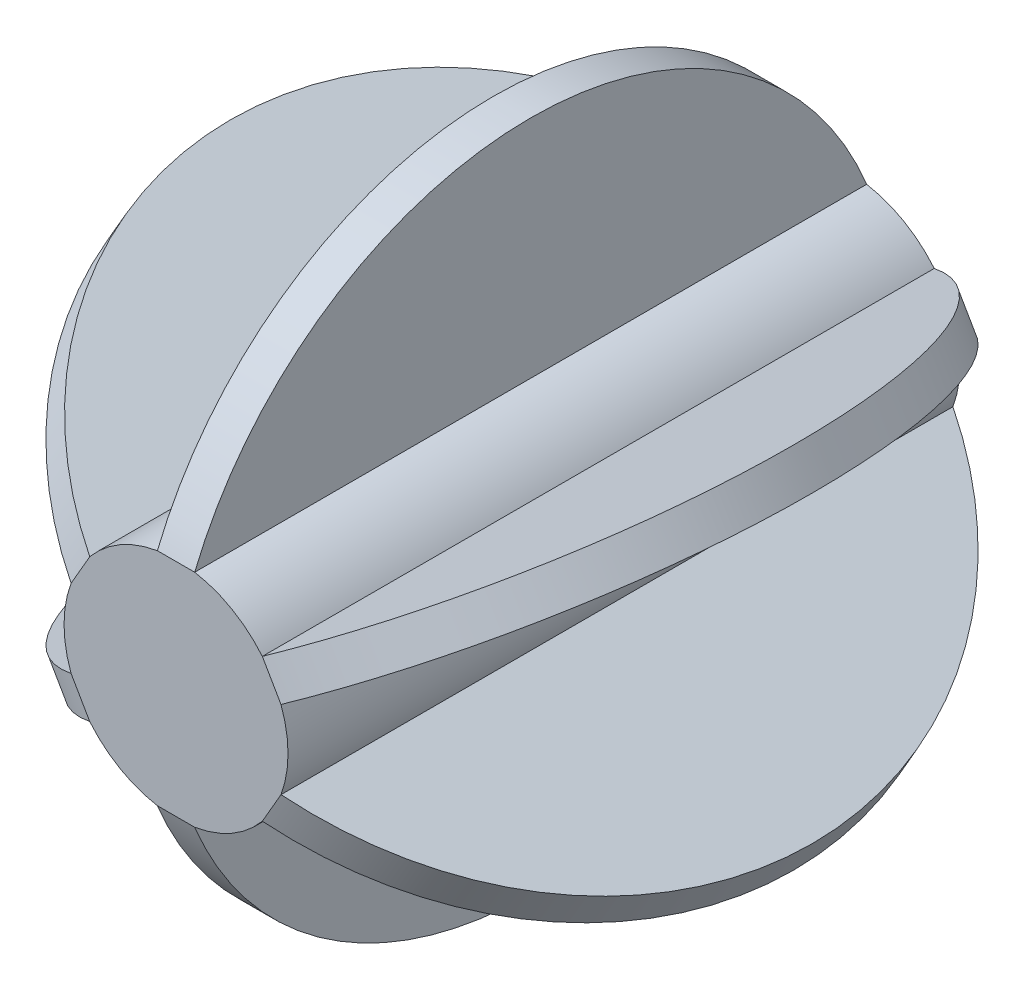
ISO-10303-21;
HEADER;
FILE_DESCRIPTION(('STEP AP214'),'2;1');
FILE_NAME('part.step','',(''),(''),'','','');
FILE_SCHEMA(('AUTOMOTIVE_DESIGN { 1 0 10303 214 1 1 1 1 }'));
ENDSEC;
DATA;
#1=APPLICATION_CONTEXT('core data for automotive mechanical design processes');
#2=APPLICATION_PROTOCOL_DEFINITION('international standard','automotive_design',2000,#1);
#3=PRODUCT_CONTEXT('',#1,'mechanical');
#4=PRODUCT('Part','Part','',(#3));
#5=PRODUCT_RELATED_PRODUCT_CATEGORY('part','',(#4));
#6=PRODUCT_DEFINITION_FORMATION('','',#4);
#7=PRODUCT_DEFINITION_CONTEXT('part definition',#1,'design');
#8=PRODUCT_DEFINITION('design','',#6,#7);
#9=PRODUCT_DEFINITION_SHAPE('','',#8);
#10=(LENGTH_UNIT() NAMED_UNIT(*) SI_UNIT(.MILLI.,.METRE.));
#11=(NAMED_UNIT(*) PLANE_ANGLE_UNIT() SI_UNIT($,.RADIAN.));
#12=(NAMED_UNIT(*) SI_UNIT($,.STERADIAN.) SOLID_ANGLE_UNIT());
#13=UNCERTAINTY_MEASURE_WITH_UNIT(LENGTH_MEASURE(1.E-05),#10,'distance_accuracy_value','');
#14=(GEOMETRIC_REPRESENTATION_CONTEXT(3) GLOBAL_UNCERTAINTY_ASSIGNED_CONTEXT((#13)) GLOBAL_UNIT_ASSIGNED_CONTEXT((#10,
#11,#12)) REPRESENTATION_CONTEXT('',''));
#15=CARTESIAN_POINT('',(0.,0.,0.));
#16=DIRECTION('',(0.,0.,1.));
#17=DIRECTION('',(1.,0.,0.));
#18=AXIS2_PLACEMENT_3D('',#15,#16,#17);
#19=CARTESIAN_POINT('',(0.,0.,90.));
#20=DIRECTION('',(0.,0.,-1.));
#21=DIRECTION('',(-1.,0.,0.));
#22=AXIS2_PLACEMENT_3D('',#19,#20,#21);
#23=CYLINDRICAL_SURFACE('',#22,15.);
#24=CARTESIAN_POINT('',(0.,0.,0.));
#25=DIRECTION('',(0.,0.,1.));
#26=DIRECTION('',(1.,0.,0.));
#27=AXIS2_PLACEMENT_3D('',#24,#25,#26);
#28=CIRCLE('',#27,15.);
#29=CARTESIAN_POINT('',(-2.50000000000006,14.790199457749,0.));
#30=VERTEX_POINT('',#29);
#31=CARTESIAN_POINT('',(-11.5586884574496,9.56016323833555,0.));
#32=VERTEX_POINT('',#31);
#33=EDGE_CURVE('E162',#30,#32,#28,.T.);
#34=ORIENTED_EDGE('',*,*,#33,.T.);
#35=DIRECTION('',(0.,0.,-1.));
#36=VECTOR('',#35,1.);
#37=CARTESIAN_POINT('',(-11.5586884574496,9.56016323833555,90.));
#38=LINE('',#37,#36);
#39=CARTESIAN_POINT('',(-11.5586884574496,9.56016323833555,90.));
#40=VERTEX_POINT('',#39);
#41=EDGE_CURVE('E176',#40,#32,#38,.T.);
#42=ORIENTED_EDGE('',*,*,#41,.F.);
#43=CARTESIAN_POINT('',(0.,0.,90.));
#44=DIRECTION('',(0.,0.,1.));
#45=DIRECTION('',(1.,0.,0.));
#46=AXIS2_PLACEMENT_3D('',#43,#44,#45);
#47=CIRCLE('',#46,15.);
#48=CARTESIAN_POINT('',(-2.50000000000017,14.790199457749,90.));
#49=VERTEX_POINT('',#48);
#50=EDGE_CURVE('E163',#49,#40,#47,.T.);
#51=ORIENTED_EDGE('',*,*,#50,.F.);
#52=DIRECTION('',(0.,0.,-1.));
#53=VECTOR('',#52,1.);
#54=CARTESIAN_POINT('',(-2.50000000000006,14.790199457749,90.));
#55=LINE('',#54,#53);
#56=EDGE_CURVE('E148',#49,#30,#55,.T.);
#57=ORIENTED_EDGE('',*,*,#56,.T.);
#58=EDGE_LOOP('',(#34,#42,#51,#57));
#59=FACE_BOUND('',#58,.T.);
#60=ADVANCED_FACE('F33',(#59),#23,.T.);
#61=CARTESIAN_POINT('',(-11.5586884574496,9.56016323833555,90.));
#62=DIRECTION('',(-0.499999999999995,-0.866025403784442,0.));
#63=DIRECTION('',(0.866025403784442,-0.499999999999995,0.));
#64=AXIS2_PLACEMENT_3D('',#61,#62,#63);
#65=PLANE('',#64);
#66=CARTESIAN_POINT('',(4.38545693247616,0.354806605463526,45.));
#67=DIRECTION('',(0.499999999999995,0.866025403784442,0.));
#68=DIRECTION('',(-0.866025403784442,0.499999999999995,0.));
#69=AXIS2_PLACEMENT_3D('',#66,#67,#68);
#70=CIRCLE('',#69,48.6205138079952);
#71=EDGE_CURVE('E47',#40,#32,#70,.F.);
#72=ORIENTED_EDGE('',*,*,#71,.F.);
#73=ORIENTED_EDGE('',*,*,#41,.T.);
#74=EDGE_LOOP('',(#72,#73));
#75=FACE_BOUND('',#74,.T.);
#76=ADVANCED_FACE('F291',(#75),#65,.F.);
#77=CARTESIAN_POINT('',(-14.0586884574495,5.23003621941334,90.));
#78=DIRECTION('',(0.499999999999995,0.866025403784442,0.));
#79=DIRECTION('',(-0.866025403784442,0.499999999999995,0.));
#80=AXIS2_PLACEMENT_3D('',#77,#78,#79);
#81=PLANE('',#80);
#82=DIRECTION('',(0.,0.,-1.));
#83=VECTOR('',#82,1.);
#84=CARTESIAN_POINT('',(-14.0586884574495,5.23003621941334,90.));
#85=LINE('',#84,#83);
#86=CARTESIAN_POINT('',(-14.0586884574495,5.23003621941334,90.));
#87=VERTEX_POINT('',#86);
#88=CARTESIAN_POINT('',(-14.0586884574495,5.23003621941334,0.));
#89=VERTEX_POINT('',#88);
#90=EDGE_CURVE('E169',#87,#89,#85,.T.);
#91=ORIENTED_EDGE('',*,*,#90,.F.);
#92=CARTESIAN_POINT('',(1.88545693247618,-3.97532041345869,45.));
#93=DIRECTION('',(0.499999999999995,0.866025403784442,0.));
#94=DIRECTION('',(-0.866025403784442,0.499999999999995,0.));
#95=AXIS2_PLACEMENT_3D('',#92,#93,#94);
#96=CIRCLE('',#95,48.6205138079952);
#97=EDGE_CURVE('E155',#87,#89,#96,.F.);
#98=ORIENTED_EDGE('',*,*,#97,.T.);
#99=EDGE_LOOP('',(#91,#98));
#100=FACE_BOUND('',#99,.T.);
#101=ADVANCED_FACE('F296',(#100),#81,.F.);
#102=CARTESIAN_POINT('',(0.,0.,90.));
#103=DIRECTION('',(0.,0.,-1.));
#104=DIRECTION('',(-1.,0.,0.));
#105=AXIS2_PLACEMENT_3D('',#102,#103,#104);
#106=CYLINDRICAL_SURFACE('',#105,15.);
#107=CARTESIAN_POINT('',(0.,0.,0.));
#108=DIRECTION('',(0.,0.,1.));
#109=DIRECTION('',(1.,0.,0.));
#110=AXIS2_PLACEMENT_3D('',#107,#108,#109);
#111=CIRCLE('',#110,15.);
#112=CARTESIAN_POINT('',(-14.0586884574495,-5.23003621941335,0.));
#113=VERTEX_POINT('',#112);
#114=EDGE_CURVE('E166',#89,#113,#111,.T.);
#115=ORIENTED_EDGE('',*,*,#114,.T.);
#116=DIRECTION('',(0.,0.,-1.));
#117=VECTOR('',#116,1.);
#118=CARTESIAN_POINT('',(-14.0586884574495,-5.23003621941334,90.));
#119=LINE('',#118,#117);
#120=CARTESIAN_POINT('',(-14.0586884574495,-5.23003621941335,90.));
#121=VERTEX_POINT('',#120);
#122=EDGE_CURVE('E232',#121,#113,#119,.T.);
#123=ORIENTED_EDGE('',*,*,#122,.F.);
#124=CARTESIAN_POINT('',(0.,0.,90.));
#125=DIRECTION('',(0.,0.,1.));
#126=DIRECTION('',(1.,0.,0.));
#127=AXIS2_PLACEMENT_3D('',#124,#125,#126);
#128=CIRCLE('',#127,15.);
#129=EDGE_CURVE('E165',#87,#121,#128,.T.);
#130=ORIENTED_EDGE('',*,*,#129,.F.);
#131=ORIENTED_EDGE('',*,*,#90,.T.);
#132=EDGE_LOOP('',(#115,#123,#130,#131));
#133=FACE_BOUND('',#132,.T.);
#134=ADVANCED_FACE('F324',(#133),#106,.T.);
#135=CARTESIAN_POINT('',(0.,0.,90.));
#136=DIRECTION('',(0.,0.,1.));
#137=DIRECTION('',(1.,0.,0.));
#138=AXIS2_PLACEMENT_3D('',#135,#136,#137);
#139=PLANE('',#138);
#140=DIRECTION('',(1.,0.,0.));
#141=VECTOR('',#140,1.);
#142=CARTESIAN_POINT('',(-97.5000000000001,14.7901994577487,90.));
#143=LINE('',#142,#141);
#144=CARTESIAN_POINT('',(2.49999999999994,14.7901994577491,90.));
#145=VERTEX_POINT('',#144);
#146=EDGE_CURVE('E129',#49,#145,#143,.T.);
#147=ORIENTED_EDGE('',*,*,#146,.F.);
#148=ORIENTED_EDGE('',*,*,#50,.T.);
#149=DIRECTION('',(0.499999999999995,0.866025403784442,0.));
#150=VECTOR('',#149,1.);
#151=CARTESIAN_POINT('',(-61.558688457449,-77.0423771401086,90.));
#152=LINE('',#151,#150);
#153=EDGE_CURVE('E180',#87,#40,#152,.T.);
#154=ORIENTED_EDGE('',*,*,#153,.F.);
#155=ORIENTED_EDGE('',*,*,#129,.T.);
#156=DIRECTION('',(-0.499999999999995,0.866025403784442,0.));
#157=VECTOR('',#156,1.);
#158=CARTESIAN_POINT('',(35.94131154255,-91.8325765978575,90.));
#159=LINE('',#158,#157);
#160=CARTESIAN_POINT('',(-11.5586884574496,-9.56016323833554,90.));
#161=VERTEX_POINT('',#160);
#162=EDGE_CURVE('E136',#161,#121,#159,.T.);
#163=ORIENTED_EDGE('',*,*,#162,.F.);
#164=CARTESIAN_POINT('',(0.,0.,90.));
#165=DIRECTION('',(0.,0.,1.));
#166=DIRECTION('',(-0.499999999999992,0.866025403784443,0.));
#167=AXIS2_PLACEMENT_3D('',#164,#165,#166);
#168=CIRCLE('',#167,15.);
#169=CARTESIAN_POINT('',(-2.50000000000005,-14.790199457749,90.));
#170=VERTEX_POINT('',#169);
#171=EDGE_CURVE('E228',#161,#170,#168,.T.);
#172=ORIENTED_EDGE('',*,*,#171,.T.);
#173=DIRECTION('',(-1.,0.,0.));
#174=VECTOR('',#173,1.);
#175=CARTESIAN_POINT('',(97.5,-14.7901994577494,90.));
#176=LINE('',#175,#174);
#177=CARTESIAN_POINT('',(2.49999999999986,-14.7901994577491,90.));
#178=VERTEX_POINT('',#177);
#179=EDGE_CURVE('E260',#178,#170,#176,.T.);
#180=ORIENTED_EDGE('',*,*,#179,.F.);
#181=CARTESIAN_POINT('',(0.,0.,90.));
#182=DIRECTION('',(0.,0.,1.));
#183=DIRECTION('',(-1.,0.,0.));
#184=AXIS2_PLACEMENT_3D('',#181,#182,#183);
#185=CIRCLE('',#184,15.);
#186=CARTESIAN_POINT('',(11.5586884574496,-9.56016323833555,90.));
#187=VERTEX_POINT('',#186);
#188=EDGE_CURVE('E216',#178,#187,#185,.T.);
#189=ORIENTED_EDGE('',*,*,#188,.T.);
#190=DIRECTION('',(-0.499999999999995,-0.866025403784442,0.));
#191=VECTOR('',#190,1.);
#192=CARTESIAN_POINT('',(61.5586884574491,77.0423771401086,90.));
#193=LINE('',#192,#191);
#194=CARTESIAN_POINT('',(14.0586884574496,-5.23003621941333,90.));
#195=VERTEX_POINT('',#194);
#196=EDGE_CURVE('E259',#195,#187,#193,.T.);
#197=ORIENTED_EDGE('',*,*,#196,.F.);
#198=CARTESIAN_POINT('',(0.,0.,90.));
#199=DIRECTION('',(0.,0.,1.));
#200=DIRECTION('',(-0.500000000000004,-0.866025403784436,0.));
#201=AXIS2_PLACEMENT_3D('',#198,#199,#200);
#202=CIRCLE('',#201,15.);
#203=CARTESIAN_POINT('',(14.0586884574495,5.23003621941345,90.));
#204=VERTEX_POINT('',#203);
#205=EDGE_CURVE('E202',#195,#204,#202,.T.);
#206=ORIENTED_EDGE('',*,*,#205,.T.);
#207=DIRECTION('',(0.500000000000001,-0.866025403784438,0.));
#208=VECTOR('',#207,1.);
#209=CARTESIAN_POINT('',(-35.9413115425506,91.8325765978573,90.));
#210=LINE('',#209,#208);
#211=CARTESIAN_POINT('',(11.5586884574495,9.56016323833564,90.));
#212=VERTEX_POINT('',#211);
#213=EDGE_CURVE('E144',#212,#204,#210,.T.);
#214=ORIENTED_EDGE('',*,*,#213,.F.);
#215=CARTESIAN_POINT('',(0.,0.,90.));
#216=DIRECTION('',(0.,0.,1.));
#217=DIRECTION('',(0.499999999999998,-0.86602540378444,0.));
#218=AXIS2_PLACEMENT_3D('',#215,#216,#217);
#219=CIRCLE('',#218,15.);
#220=EDGE_CURVE('E140',#212,#145,#219,.T.);
#221=ORIENTED_EDGE('',*,*,#220,.T.);
#222=EDGE_LOOP('',(#147,#148,#154,#155,#163,#172,#180,#189,#197,#206,#214,#221));
#223=FACE_BOUND('',#222,.T.);
#224=ADVANCED_FACE('F141',(#223),#139,.T.);
#225=CARTESIAN_POINT('',(0.,0.,0.));
#226=DIRECTION('',(0.,0.,1.));
#227=DIRECTION('',(1.,0.,0.));
#228=AXIS2_PLACEMENT_3D('',#225,#226,#227);
#229=PLANE('',#228);
#230=ORIENTED_EDGE('',*,*,#33,.F.);
#231=DIRECTION('',(1.,0.,0.));
#232=VECTOR('',#231,1.);
#233=CARTESIAN_POINT('',(-97.5000000000001,14.7901994577487,0.));
#234=LINE('',#233,#232);
#235=CARTESIAN_POINT('',(2.49999999999995,14.7901994577491,0.));
#236=VERTEX_POINT('',#235);
#237=EDGE_CURVE('E125',#30,#236,#234,.T.);
#238=ORIENTED_EDGE('',*,*,#237,.T.);
#239=CARTESIAN_POINT('',(0.,0.,0.));
#240=DIRECTION('',(0.,0.,1.));
#241=DIRECTION('',(0.499999999999998,-0.86602540378444,0.));
#242=AXIS2_PLACEMENT_3D('',#239,#240,#241);
#243=CIRCLE('',#242,15.);
#244=CARTESIAN_POINT('',(11.5586884574495,9.56016323833564,0.));
#245=VERTEX_POINT('',#244);
#246=EDGE_CURVE('E149',#245,#236,#243,.T.);
#247=ORIENTED_EDGE('',*,*,#246,.F.);
#248=DIRECTION('',(0.500000000000001,-0.866025403784438,0.));
#249=VECTOR('',#248,1.);
#250=CARTESIAN_POINT('',(-35.9413115425506,91.8325765978572,0.));
#251=LINE('',#250,#249);
#252=CARTESIAN_POINT('',(14.0586884574495,5.23003621941344,0.));
#253=VERTEX_POINT('',#252);
#254=EDGE_CURVE('E126',#245,#253,#251,.T.);
#255=ORIENTED_EDGE('',*,*,#254,.T.);
#256=CARTESIAN_POINT('',(0.,0.,0.));
#257=DIRECTION('',(0.,0.,1.));
#258=DIRECTION('',(-0.500000000000004,-0.866025403784436,0.));
#259=AXIS2_PLACEMENT_3D('',#256,#257,#258);
#260=CIRCLE('',#259,15.);
#261=CARTESIAN_POINT('',(14.0586884574495,-5.23003621941334,0.));
#262=VERTEX_POINT('',#261);
#263=EDGE_CURVE('E206',#262,#253,#260,.T.);
#264=ORIENTED_EDGE('',*,*,#263,.F.);
#265=DIRECTION('',(-0.499999999999995,-0.866025403784442,0.));
#266=VECTOR('',#265,1.);
#267=CARTESIAN_POINT('',(61.5586884574491,77.0423771401086,0.));
#268=LINE('',#267,#266);
#269=CARTESIAN_POINT('',(11.5586884574496,-9.56016323833555,0.));
#270=VERTEX_POINT('',#269);
#271=EDGE_CURVE('E244',#262,#270,#268,.T.);
#272=ORIENTED_EDGE('',*,*,#271,.T.);
#273=CARTESIAN_POINT('',(0.,0.,0.));
#274=DIRECTION('',(0.,0.,1.));
#275=DIRECTION('',(-1.,0.,0.));
#276=AXIS2_PLACEMENT_3D('',#273,#274,#275);
#277=CIRCLE('',#276,15.);
#278=CARTESIAN_POINT('',(2.49999999999995,-14.790199457749,0.));
#279=VERTEX_POINT('',#278);
#280=EDGE_CURVE('E217',#279,#270,#277,.T.);
#281=ORIENTED_EDGE('',*,*,#280,.F.);
#282=DIRECTION('',(-1.,0.,0.));
#283=VECTOR('',#282,1.);
#284=CARTESIAN_POINT('',(97.5,-14.7901994577494,0.));
#285=LINE('',#284,#283);
#286=CARTESIAN_POINT('',(-2.50000000000005,-14.790199457749,0.));
#287=VERTEX_POINT('',#286);
#288=EDGE_CURVE('E249',#279,#287,#285,.T.);
#289=ORIENTED_EDGE('',*,*,#288,.T.);
#290=CARTESIAN_POINT('',(0.,0.,0.));
#291=DIRECTION('',(0.,0.,1.));
#292=DIRECTION('',(-0.499999999999992,0.866025403784443,0.));
#293=AXIS2_PLACEMENT_3D('',#290,#291,#292);
#294=CIRCLE('',#293,15.);
#295=CARTESIAN_POINT('',(-11.5586884574496,-9.56016323833555,0.));
#296=VERTEX_POINT('',#295);
#297=EDGE_CURVE('E229',#296,#287,#294,.T.);
#298=ORIENTED_EDGE('',*,*,#297,.F.);
#299=DIRECTION('',(-0.499999999999995,0.866025403784442,0.));
#300=VECTOR('',#299,1.);
#301=CARTESIAN_POINT('',(35.94131154255,-91.8325765978575,0.));
#302=LINE('',#301,#300);
#303=EDGE_CURVE('E254',#296,#113,#302,.T.);
#304=ORIENTED_EDGE('',*,*,#303,.T.);
#305=ORIENTED_EDGE('',*,*,#114,.F.);
#306=DIRECTION('',(0.499999999999995,0.866025403784442,0.));
#307=VECTOR('',#306,1.);
#308=CARTESIAN_POINT('',(-61.558688457449,-77.0423771401086,0.));
#309=LINE('',#308,#307);
#310=EDGE_CURVE('E51',#89,#32,#309,.T.);
#311=ORIENTED_EDGE('',*,*,#310,.T.);
#312=EDGE_LOOP('',(#230,#238,#247,#255,#264,#272,#281,#289,#298,#304,#305,#311));
#313=FACE_BOUND('',#312,.T.);
#314=ADVANCED_FACE('F198',(#313),#229,.F.);
#315=CARTESIAN_POINT('',(-45.6145430675233,-86.2477337729806,45.));
#316=DIRECTION('',(0.499999999999995,0.866025403784442,0.));
#317=DIRECTION('',(-0.866025403784442,0.499999999999995,0.));
#318=AXIS2_PLACEMENT_3D('',#315,#316,#317);
#319=CYLINDRICAL_SURFACE('',#318,48.6205138079952);
#320=ORIENTED_EDGE('',*,*,#97,.F.);
#321=ORIENTED_EDGE('',*,*,#153,.T.);
#322=ORIENTED_EDGE('',*,*,#71,.T.);
#323=ORIENTED_EDGE('',*,*,#310,.F.);
#324=EDGE_LOOP('',(#320,#321,#322,#323));
#325=FACE_BOUND('',#324,.T.);
#326=ADVANCED_FACE('F301',(#325),#319,.T.);
#327=CARTESIAN_POINT('',(0.,0.,90.));
#328=DIRECTION('',(0.,0.,-1.));
#329=DIRECTION('',(-1.,0.,0.));
#330=AXIS2_PLACEMENT_3D('',#327,#328,#329);
#331=CYLINDRICAL_SURFACE('',#330,15.);
#332=ORIENTED_EDGE('',*,*,#246,.T.);
#333=DIRECTION('',(0.,0.,-1.));
#334=VECTOR('',#333,1.);
#335=CARTESIAN_POINT('',(2.49999999999994,14.790199457749,90.));
#336=LINE('',#335,#334);
#337=EDGE_CURVE('E122',#145,#236,#336,.T.);
#338=ORIENTED_EDGE('',*,*,#337,.F.);
#339=ORIENTED_EDGE('',*,*,#220,.F.);
#340=DIRECTION('',(0.,0.,-1.));
#341=VECTOR('',#340,1.);
#342=CARTESIAN_POINT('',(11.5586884574495,9.56016323833564,90.));
#343=LINE('',#342,#341);
#344=EDGE_CURVE('E193',#212,#245,#343,.T.);
#345=ORIENTED_EDGE('',*,*,#344,.T.);
#346=EDGE_LOOP('',(#332,#338,#339,#345));
#347=FACE_BOUND('',#346,.T.);
#348=ADVANCED_FACE('F152',(#347),#331,.T.);
#349=CARTESIAN_POINT('',(2.49999999999994,14.790199457749,90.));
#350=DIRECTION('',(-1.,0.,0.));
#351=DIRECTION('',(0.,-1.,0.));
#352=AXIS2_PLACEMENT_3D('',#349,#350,#351);
#353=PLANE('',#352);
#354=CARTESIAN_POINT('',(2.50000000000001,-3.62051380799517,45.));
#355=DIRECTION('',(1.,0.,0.));
#356=DIRECTION('',(0.,1.,0.));
#357=AXIS2_PLACEMENT_3D('',#354,#355,#356);
#358=CIRCLE('',#357,48.6205138079952);
#359=EDGE_CURVE('E118',#145,#236,#358,.F.);
#360=ORIENTED_EDGE('',*,*,#359,.F.);
#361=ORIENTED_EDGE('',*,*,#337,.T.);
#362=EDGE_LOOP('',(#360,#361));
#363=FACE_BOUND('',#362,.T.);
#364=ADVANCED_FACE('F120',(#363),#353,.F.);
#365=CARTESIAN_POINT('',(-2.50000000000006,14.790199457749,90.));
#366=DIRECTION('',(1.,0.,0.));
#367=DIRECTION('',(0.,1.,0.));
#368=AXIS2_PLACEMENT_3D('',#365,#366,#367);
#369=PLANE('',#368);
#370=ORIENTED_EDGE('',*,*,#56,.F.);
#371=CARTESIAN_POINT('',(-2.49999999999999,-3.62051380799519,45.));
#372=DIRECTION('',(1.,0.,0.));
#373=DIRECTION('',(0.,1.,0.));
#374=AXIS2_PLACEMENT_3D('',#371,#372,#373);
#375=CIRCLE('',#374,48.6205138079952);
#376=EDGE_CURVE('E11',#49,#30,#375,.F.);
#377=ORIENTED_EDGE('',*,*,#376,.T.);
#378=EDGE_LOOP('',(#370,#377));
#379=FACE_BOUND('',#378,.T.);
#380=ADVANCED_FACE('F304',(#379),#369,.F.);
#381=CARTESIAN_POINT('',(0.,0.,90.));
#382=DIRECTION('',(0.,0.,-1.));
#383=DIRECTION('',(-1.,0.,0.));
#384=AXIS2_PLACEMENT_3D('',#381,#382,#383);
#385=CYLINDRICAL_SURFACE('',#384,15.);
#386=ORIENTED_EDGE('',*,*,#263,.T.);
#387=DIRECTION('',(0.,0.,-1.));
#388=VECTOR('',#387,1.);
#389=CARTESIAN_POINT('',(14.0586884574495,5.23003621941344,90.));
#390=LINE('',#389,#388);
#391=EDGE_CURVE('E201',#204,#253,#390,.T.);
#392=ORIENTED_EDGE('',*,*,#391,.F.);
#393=ORIENTED_EDGE('',*,*,#205,.F.);
#394=DIRECTION('',(0.,0.,-1.));
#395=VECTOR('',#394,1.);
#396=CARTESIAN_POINT('',(14.0586884574495,-5.23003621941334,90.));
#397=LINE('',#396,#395);
#398=EDGE_CURVE('E213',#195,#262,#397,.T.);
#399=ORIENTED_EDGE('',*,*,#398,.T.);
#400=EDGE_LOOP('',(#386,#392,#393,#399));
#401=FACE_BOUND('',#400,.T.);
#402=ADVANCED_FACE('F306',(#401),#385,.T.);
#403=CARTESIAN_POINT('',(14.0586884574495,5.23003621941344,90.));
#404=DIRECTION('',(-0.500000000000001,0.866025403784438,0.));
#405=DIRECTION('',(-0.866025403784438,-0.500000000000001,0.));
#406=AXIS2_PLACEMENT_3D('',#403,#404,#405);
#407=PLANE('',#406);
#408=CARTESIAN_POINT('',(-1.88545693247616,-3.97532041345869,45.));
#409=DIRECTION('',(0.500000000000001,-0.866025403784438,0.));
#410=DIRECTION('',(0.866025403784438,0.500000000000001,0.));
#411=AXIS2_PLACEMENT_3D('',#408,#409,#410);
#412=CIRCLE('',#411,48.6205138079952);
#413=EDGE_CURVE('E242',#204,#253,#412,.F.);
#414=ORIENTED_EDGE('',*,*,#413,.F.);
#415=ORIENTED_EDGE('',*,*,#391,.T.);
#416=EDGE_LOOP('',(#414,#415));
#417=FACE_BOUND('',#416,.T.);
#418=ADVANCED_FACE('F312',(#417),#407,.F.);
#419=CARTESIAN_POINT('',(11.5586884574495,9.56016323833564,90.));
#420=DIRECTION('',(0.500000000000001,-0.866025403784438,0.));
#421=DIRECTION('',(0.866025403784438,0.500000000000001,0.));
#422=AXIS2_PLACEMENT_3D('',#419,#420,#421);
#423=PLANE('',#422);
#424=ORIENTED_EDGE('',*,*,#344,.F.);
#425=CARTESIAN_POINT('',(-4.38545693247616,0.354806605463498,45.));
#426=DIRECTION('',(0.500000000000001,-0.866025403784438,0.));
#427=DIRECTION('',(0.866025403784438,0.500000000000001,0.));
#428=AXIS2_PLACEMENT_3D('',#425,#426,#427);
#429=CIRCLE('',#428,48.6205138079952);
#430=EDGE_CURVE('E40',#212,#245,#429,.F.);
#431=ORIENTED_EDGE('',*,*,#430,.T.);
#432=EDGE_LOOP('',(#424,#431));
#433=FACE_BOUND('',#432,.T.);
#434=ADVANCED_FACE('F192',(#433),#423,.F.);
#435=CARTESIAN_POINT('',(0.,0.,90.));
#436=DIRECTION('',(0.,0.,-1.));
#437=DIRECTION('',(-1.,0.,0.));
#438=AXIS2_PLACEMENT_3D('',#435,#436,#437);
#439=CYLINDRICAL_SURFACE('',#438,15.);
#440=ORIENTED_EDGE('',*,*,#280,.T.);
#441=DIRECTION('',(0.,0.,-1.));
#442=VECTOR('',#441,1.);
#443=CARTESIAN_POINT('',(11.5586884574496,-9.56016323833555,90.));
#444=LINE('',#443,#442);
#445=EDGE_CURVE('E209',#187,#270,#444,.T.);
#446=ORIENTED_EDGE('',*,*,#445,.F.);
#447=ORIENTED_EDGE('',*,*,#188,.F.);
#448=DIRECTION('',(0.,0.,-1.));
#449=VECTOR('',#448,1.);
#450=CARTESIAN_POINT('',(2.49999999999995,-14.790199457749,90.));
#451=LINE('',#450,#449);
#452=EDGE_CURVE('E225',#178,#279,#451,.T.);
#453=ORIENTED_EDGE('',*,*,#452,.T.);
#454=EDGE_LOOP('',(#440,#446,#447,#453));
#455=FACE_BOUND('',#454,.T.);
#456=ADVANCED_FACE('F275',(#455),#439,.T.);
#457=CARTESIAN_POINT('',(11.5586884574496,-9.56016323833555,90.));
#458=DIRECTION('',(0.499999999999995,0.866025403784442,0.));
#459=DIRECTION('',(-0.866025403784442,0.499999999999995,0.));
#460=AXIS2_PLACEMENT_3D('',#457,#458,#459);
#461=PLANE('',#460);
#462=CARTESIAN_POINT('',(-4.38545693247616,-0.354806605463526,45.));
#463=DIRECTION('',(-0.499999999999995,-0.866025403784442,0.));
#464=DIRECTION('',(0.866025403784442,-0.499999999999995,0.));
#465=AXIS2_PLACEMENT_3D('',#462,#463,#464);
#466=CIRCLE('',#465,48.6205138079952);
#467=EDGE_CURVE('E247',#187,#270,#466,.F.);
#468=ORIENTED_EDGE('',*,*,#467,.F.);
#469=ORIENTED_EDGE('',*,*,#445,.T.);
#470=EDGE_LOOP('',(#468,#469));
#471=FACE_BOUND('',#470,.T.);
#472=ADVANCED_FACE('F278',(#471),#461,.F.);
#473=CARTESIAN_POINT('',(14.0586884574495,-5.23003621941334,90.));
#474=DIRECTION('',(-0.499999999999995,-0.866025403784442,0.));
#475=DIRECTION('',(0.866025403784442,-0.499999999999995,0.));
#476=AXIS2_PLACEMENT_3D('',#473,#474,#475);
#477=PLANE('',#476);
#478=ORIENTED_EDGE('',*,*,#398,.F.);
#479=CARTESIAN_POINT('',(-1.88545693247618,3.97532041345869,45.));
#480=DIRECTION('',(-0.499999999999995,-0.866025403784442,0.));
#481=DIRECTION('',(0.866025403784442,-0.499999999999995,0.));
#482=AXIS2_PLACEMENT_3D('',#479,#480,#481);
#483=CIRCLE('',#482,48.6205138079952);
#484=EDGE_CURVE('E188',#195,#262,#483,.F.);
#485=ORIENTED_EDGE('',*,*,#484,.T.);
#486=EDGE_LOOP('',(#478,#485));
#487=FACE_BOUND('',#486,.T.);
#488=ADVANCED_FACE('F280',(#487),#477,.F.);
#489=CARTESIAN_POINT('',(0.,0.,90.));
#490=DIRECTION('',(0.,0.,-1.));
#491=DIRECTION('',(-1.,0.,0.));
#492=AXIS2_PLACEMENT_3D('',#489,#490,#491);
#493=CYLINDRICAL_SURFACE('',#492,15.);
#494=ORIENTED_EDGE('',*,*,#297,.T.);
#495=DIRECTION('',(0.,0.,-1.));
#496=VECTOR('',#495,1.);
#497=CARTESIAN_POINT('',(-2.50000000000005,-14.790199457749,90.));
#498=LINE('',#497,#496);
#499=EDGE_CURVE('E220',#170,#287,#498,.T.);
#500=ORIENTED_EDGE('',*,*,#499,.F.);
#501=ORIENTED_EDGE('',*,*,#171,.F.);
#502=DIRECTION('',(0.,0.,-1.));
#503=VECTOR('',#502,1.);
#504=CARTESIAN_POINT('',(-11.5586884574496,-9.56016323833555,90.));
#505=LINE('',#504,#503);
#506=EDGE_CURVE('E237',#161,#296,#505,.T.);
#507=ORIENTED_EDGE('',*,*,#506,.T.);
#508=EDGE_LOOP('',(#494,#500,#501,#507));
#509=FACE_BOUND('',#508,.T.);
#510=ADVANCED_FACE('F286',(#509),#493,.T.);
#511=CARTESIAN_POINT('',(-2.50000000000005,-14.790199457749,90.));
#512=DIRECTION('',(1.,0.,0.));
#513=DIRECTION('',(0.,1.,0.));
#514=AXIS2_PLACEMENT_3D('',#511,#512,#513);
#515=PLANE('',#514);
#516=CARTESIAN_POINT('',(-2.49999999999998,3.62051380799519,45.));
#517=DIRECTION('',(-1.,0.,0.));
#518=DIRECTION('',(0.,-1.,0.));
#519=AXIS2_PLACEMENT_3D('',#516,#517,#518);
#520=CIRCLE('',#519,48.6205138079952);
#521=EDGE_CURVE('E252',#170,#287,#520,.F.);
#522=ORIENTED_EDGE('',*,*,#521,.F.);
#523=ORIENTED_EDGE('',*,*,#499,.T.);
#524=EDGE_LOOP('',(#522,#523));
#525=FACE_BOUND('',#524,.T.);
#526=ADVANCED_FACE('F347',(#525),#515,.F.);
#527=CARTESIAN_POINT('',(2.49999999999995,-14.790199457749,90.));
#528=DIRECTION('',(-1.,0.,0.));
#529=DIRECTION('',(0.,-1.,0.));
#530=AXIS2_PLACEMENT_3D('',#527,#528,#529);
#531=PLANE('',#530);
#532=ORIENTED_EDGE('',*,*,#452,.F.);
#533=CARTESIAN_POINT('',(2.50000000000002,3.62051380799517,45.));
#534=DIRECTION('',(-1.,0.,0.));
#535=DIRECTION('',(0.,-1.,0.));
#536=AXIS2_PLACEMENT_3D('',#533,#534,#535);
#537=CIRCLE('',#536,48.6205138079952);
#538=EDGE_CURVE('E185',#178,#279,#537,.F.);
#539=ORIENTED_EDGE('',*,*,#538,.T.);
#540=EDGE_LOOP('',(#532,#539));
#541=FACE_BOUND('',#540,.T.);
#542=ADVANCED_FACE('F351',(#541),#531,.F.);
#543=CARTESIAN_POINT('',(-14.0586884574495,-5.23003621941334,90.));
#544=DIRECTION('',(0.499999999999995,-0.866025403784441,0.));
#545=DIRECTION('',(0.866025403784442,0.499999999999995,0.));
#546=AXIS2_PLACEMENT_3D('',#543,#544,#545);
#547=PLANE('',#546);
#548=CARTESIAN_POINT('',(1.88545693247619,3.97532041345867,45.));
#549=DIRECTION('',(-0.499999999999995,0.866025403784441,0.));
#550=DIRECTION('',(-0.866025403784441,-0.499999999999995,0.));
#551=AXIS2_PLACEMENT_3D('',#548,#549,#550);
#552=CIRCLE('',#551,48.6205138079952);
#553=EDGE_CURVE('E135',#121,#113,#552,.F.);
#554=ORIENTED_EDGE('',*,*,#553,.F.);
#555=ORIENTED_EDGE('',*,*,#122,.T.);
#556=EDGE_LOOP('',(#554,#555));
#557=FACE_BOUND('',#556,.T.);
#558=ADVANCED_FACE('F369',(#557),#547,.F.);
#559=CARTESIAN_POINT('',(-11.5586884574496,-9.56016323833556,90.));
#560=DIRECTION('',(-0.499999999999995,0.866025403784441,0.));
#561=DIRECTION('',(-0.866025403784441,-0.499999999999995,0.));
#562=AXIS2_PLACEMENT_3D('',#559,#560,#561);
#563=PLANE('',#562);
#564=ORIENTED_EDGE('',*,*,#506,.F.);
#565=CARTESIAN_POINT('',(4.38545693247615,-0.354806605463526,45.));
#566=DIRECTION('',(-0.499999999999995,0.866025403784441,0.));
#567=DIRECTION('',(-0.866025403784441,-0.499999999999995,0.));
#568=AXIS2_PLACEMENT_3D('',#565,#566,#567);
#569=CIRCLE('',#568,48.6205138079952);
#570=EDGE_CURVE('E182',#161,#296,#569,.F.);
#571=ORIENTED_EDGE('',*,*,#570,.T.);
#572=EDGE_LOOP('',(#564,#571));
#573=FACE_BOUND('',#572,.T.);
#574=ADVANCED_FACE('F344',(#573),#563,.F.);
#575=CARTESIAN_POINT('',(51.8854569324757,-82.6272199649855,45.));
#576=DIRECTION('',(-0.499999999999995,0.866025403784442,0.));
#577=DIRECTION('',(-0.866025403784442,-0.499999999999995,0.));
#578=AXIS2_PLACEMENT_3D('',#575,#576,#577);
#579=CYLINDRICAL_SURFACE('',#578,48.6205138079952);
#580=ORIENTED_EDGE('',*,*,#570,.F.);
#581=ORIENTED_EDGE('',*,*,#162,.T.);
#582=ORIENTED_EDGE('',*,*,#553,.T.);
#583=ORIENTED_EDGE('',*,*,#303,.F.);
#584=EDGE_LOOP('',(#580,#581,#582,#583));
#585=FACE_BOUND('',#584,.T.);
#586=ADVANCED_FACE('F368',(#585),#579,.T.);
#587=CARTESIAN_POINT('',(97.5,3.62051380799486,45.));
#588=DIRECTION('',(-1.,0.,0.));
#589=DIRECTION('',(0.,-1.,0.));
#590=AXIS2_PLACEMENT_3D('',#587,#588,#589);
#591=CYLINDRICAL_SURFACE('',#590,48.6205138079952);
#592=ORIENTED_EDGE('',*,*,#538,.F.);
#593=ORIENTED_EDGE('',*,*,#179,.T.);
#594=ORIENTED_EDGE('',*,*,#521,.T.);
#595=ORIENTED_EDGE('',*,*,#288,.F.);
#596=EDGE_LOOP('',(#592,#593,#594,#595));
#597=FACE_BOUND('',#596,.T.);
#598=ADVANCED_FACE('F349',(#597),#591,.T.);
#599=CARTESIAN_POINT('',(45.6145430675233,86.2477337729806,45.));
#600=DIRECTION('',(-0.499999999999995,-0.866025403784442,0.));
#601=DIRECTION('',(0.866025403784442,-0.499999999999995,0.));
#602=AXIS2_PLACEMENT_3D('',#599,#600,#601);
#603=CYLINDRICAL_SURFACE('',#602,48.6205138079952);
#604=ORIENTED_EDGE('',*,*,#484,.F.);
#605=ORIENTED_EDGE('',*,*,#196,.T.);
#606=ORIENTED_EDGE('',*,*,#467,.T.);
#607=ORIENTED_EDGE('',*,*,#271,.F.);
#608=EDGE_LOOP('',(#604,#605,#606,#607));
#609=FACE_BOUND('',#608,.T.);
#610=ADVANCED_FACE('F268',(#609),#603,.T.);
#611=CARTESIAN_POINT('',(-51.8854569324763,82.6272199649851,45.));
#612=DIRECTION('',(0.500000000000001,-0.866025403784438,0.));
#613=DIRECTION('',(0.866025403784438,0.500000000000001,0.));
#614=AXIS2_PLACEMENT_3D('',#611,#612,#613);
#615=CYLINDRICAL_SURFACE('',#614,48.6205138079952);
#616=ORIENTED_EDGE('',*,*,#430,.F.);
#617=ORIENTED_EDGE('',*,*,#213,.T.);
#618=ORIENTED_EDGE('',*,*,#413,.T.);
#619=ORIENTED_EDGE('',*,*,#254,.F.);
#620=EDGE_LOOP('',(#616,#617,#618,#619));
#621=FACE_BOUND('',#620,.T.);
#622=ADVANCED_FACE('F355',(#621),#615,.T.);
#623=CARTESIAN_POINT('',(-97.5,-3.62051380799554,45.));
#624=DIRECTION('',(1.,0.,0.));
#625=DIRECTION('',(0.,1.,0.));
#626=AXIS2_PLACEMENT_3D('',#623,#624,#625);
#627=CYLINDRICAL_SURFACE('',#626,48.6205138079952);
#628=ORIENTED_EDGE('',*,*,#376,.F.);
#629=ORIENTED_EDGE('',*,*,#146,.T.);
#630=ORIENTED_EDGE('',*,*,#359,.T.);
#631=ORIENTED_EDGE('',*,*,#237,.F.);
#632=EDGE_LOOP('',(#628,#629,#630,#631));
#633=FACE_BOUND('',#632,.T.);
#634=ADVANCED_FACE('F131',(#633),#627,.T.);
#635=CLOSED_SHELL('',(#60,#76,#101,#134,#224,#314,#326,#348,#364,#380,#402,#418,#434,#456,#472,
#488,#510,#526,#542,#558,#574,#586,#598,#610,#622,#634));
#636=MANIFOLD_SOLID_BREP('B2',#635);
#637=ADVANCED_BREP_SHAPE_REPRESENTATION('',(#18,#636),#14);
#638=SHAPE_DEFINITION_REPRESENTATION(#9,#637);
ENDSEC;
END-ISO-10303-21;
